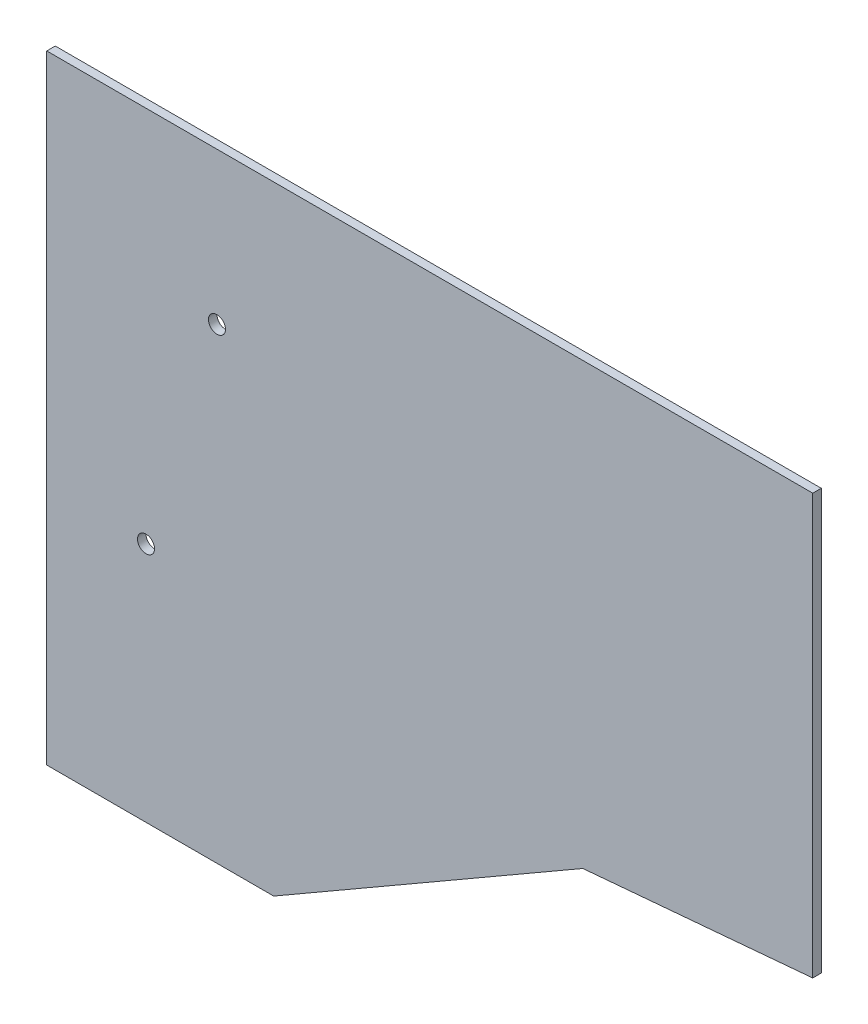
ISO-10303-21;
HEADER;
FILE_DESCRIPTION(('STEP AP214'),'2;1');
FILE_NAME('part.step','',(''),(''),'','','');
FILE_SCHEMA(('AUTOMOTIVE_DESIGN { 1 0 10303 214 1 1 1 1 }'));
ENDSEC;
DATA;
#1=APPLICATION_CONTEXT('core data for automotive mechanical design processes');
#2=APPLICATION_PROTOCOL_DEFINITION('international standard','automotive_design',2000,#1);
#3=PRODUCT_CONTEXT('',#1,'mechanical');
#4=PRODUCT('Part','Part','',(#3));
#5=PRODUCT_RELATED_PRODUCT_CATEGORY('part','',(#4));
#6=PRODUCT_DEFINITION_FORMATION('','',#4);
#7=PRODUCT_DEFINITION_CONTEXT('part definition',#1,'design');
#8=PRODUCT_DEFINITION('design','',#6,#7);
#9=PRODUCT_DEFINITION_SHAPE('','',#8);
#10=(LENGTH_UNIT() NAMED_UNIT(*) SI_UNIT(.MILLI.,.METRE.));
#11=(NAMED_UNIT(*) PLANE_ANGLE_UNIT() SI_UNIT($,.RADIAN.));
#12=(NAMED_UNIT(*) SI_UNIT($,.STERADIAN.) SOLID_ANGLE_UNIT());
#13=UNCERTAINTY_MEASURE_WITH_UNIT(LENGTH_MEASURE(1.E-05),#10,'distance_accuracy_value','');
#14=(GEOMETRIC_REPRESENTATION_CONTEXT(3) GLOBAL_UNCERTAINTY_ASSIGNED_CONTEXT((#13)) GLOBAL_UNIT_ASSIGNED_CONTEXT((#10,
#11,#12)) REPRESENTATION_CONTEXT('',''));
#15=CARTESIAN_POINT('',(0.,0.,0.));
#16=DIRECTION('',(0.,0.,1.));
#17=DIRECTION('',(1.,0.,0.));
#18=AXIS2_PLACEMENT_3D('',#15,#16,#17);
#19=CARTESIAN_POINT('',(135.,-109.,3.));
#20=DIRECTION('',(0.,1.,0.));
#21=DIRECTION('',(-1.,0.,0.));
#22=AXIS2_PLACEMENT_3D('',#19,#20,#21);
#23=PLANE('',#22);
#24=DIRECTION('',(0.,0.,-1.));
#25=VECTOR('',#24,1.);
#26=CARTESIAN_POINT('',(-55.,-109.,440.543225511879));
#27=LINE('',#26,#25);
#28=CARTESIAN_POINT('',(-55.,-109.,3.));
#29=VERTEX_POINT('',#28);
#30=CARTESIAN_POINT('',(-55.,-109.,0.));
#31=VERTEX_POINT('',#30);
#32=EDGE_CURVE('E97',#29,#31,#27,.T.);
#33=ORIENTED_EDGE('',*,*,#32,.F.);
#34=DIRECTION('',(1.,0.,0.));
#35=VECTOR('',#34,1.);
#36=CARTESIAN_POINT('',(135.,-109.,3.));
#37=LINE('',#36,#35);
#38=CARTESIAN_POINT('',(-135.,-109.,3.));
#39=VERTEX_POINT('',#38);
#40=EDGE_CURVE('E118',#39,#29,#37,.T.);
#41=ORIENTED_EDGE('',*,*,#40,.F.);
#42=DIRECTION('',(0.,0.,-1.));
#43=VECTOR('',#42,1.);
#44=CARTESIAN_POINT('',(-135.,-109.,3.));
#45=LINE('',#44,#43);
#46=CARTESIAN_POINT('',(-135.,-109.,0.));
#47=VERTEX_POINT('',#46);
#48=EDGE_CURVE('E98',#39,#47,#45,.T.);
#49=ORIENTED_EDGE('',*,*,#48,.T.);
#50=DIRECTION('',(1.,0.,0.));
#51=VECTOR('',#50,1.);
#52=CARTESIAN_POINT('',(135.,-109.,0.));
#53=LINE('',#52,#51);
#54=EDGE_CURVE('E129',#47,#31,#53,.T.);
#55=ORIENTED_EDGE('',*,*,#54,.T.);
#56=EDGE_LOOP('',(#33,#41,#49,#55));
#57=FACE_BOUND('',#56,.T.);
#58=ADVANCED_FACE('F33',(#57),#23,.F.);
#59=CARTESIAN_POINT('',(135.,-109.,3.));
#60=DIRECTION('',(-1.,0.,0.));
#61=DIRECTION('',(0.,0.,1.));
#62=AXIS2_PLACEMENT_3D('',#59,#60,#61);
#63=PLANE('',#62);
#64=DIRECTION('',(0.,0.,-1.));
#65=VECTOR('',#64,1.);
#66=CARTESIAN_POINT('',(135.,-39.,440.543225511879));
#67=LINE('',#66,#65);
#68=CARTESIAN_POINT('',(135.,-39.,3.));
#69=VERTEX_POINT('',#68);
#70=CARTESIAN_POINT('',(135.,-39.,0.));
#71=VERTEX_POINT('',#70);
#72=EDGE_CURVE('E101',#69,#71,#67,.T.);
#73=ORIENTED_EDGE('',*,*,#72,.T.);
#74=DIRECTION('',(0.,1.,0.));
#75=VECTOR('',#74,1.);
#76=CARTESIAN_POINT('',(135.,-109.,0.));
#77=LINE('',#76,#75);
#78=CARTESIAN_POINT('',(135.,109.,0.));
#79=VERTEX_POINT('',#78);
#80=EDGE_CURVE('E88',#71,#79,#77,.T.);
#81=ORIENTED_EDGE('',*,*,#80,.T.);
#82=DIRECTION('',(0.,0.,-1.));
#83=VECTOR('',#82,1.);
#84=CARTESIAN_POINT('',(135.,109.,3.));
#85=LINE('',#84,#83);
#86=CARTESIAN_POINT('',(135.,109.,3.));
#87=VERTEX_POINT('',#86);
#88=EDGE_CURVE('E135',#87,#79,#85,.T.);
#89=ORIENTED_EDGE('',*,*,#88,.F.);
#90=DIRECTION('',(0.,1.,0.));
#91=VECTOR('',#90,1.);
#92=CARTESIAN_POINT('',(135.,-109.,3.));
#93=LINE('',#92,#91);
#94=EDGE_CURVE('E121',#69,#87,#93,.T.);
#95=ORIENTED_EDGE('',*,*,#94,.F.);
#96=EDGE_LOOP('',(#73,#81,#89,#95));
#97=FACE_BOUND('',#96,.T.);
#98=ADVANCED_FACE('F160',(#97),#63,.F.);
#99=CARTESIAN_POINT('',(0.,0.,3.));
#100=DIRECTION('',(0.,0.,1.));
#101=DIRECTION('',(1.,0.,0.));
#102=AXIS2_PLACEMENT_3D('',#99,#100,#101);
#103=PLANE('',#102);
#104=CARTESIAN_POINT('',(-75.,55.5,3.));
#105=DIRECTION('',(0.,0.,1.));
#106=DIRECTION('',(1.,0.,0.));
#107=AXIS2_PLACEMENT_3D('',#104,#105,#106);
#108=CIRCLE('',#107,3.00000000000001);
#109=CARTESIAN_POINT('',(-72.,55.5,3.));
#110=VERTEX_POINT('',#109);
#111=EDGE_CURVE('E107',#110,#110,#108,.T.);
#112=ORIENTED_EDGE('',*,*,#111,.F.);
#113=EDGE_LOOP('',(#112));
#114=FACE_BOUND('',#113,.T.);
#115=CARTESIAN_POINT('',(-100.,-24.,3.));
#116=DIRECTION('',(0.,0.,1.));
#117=DIRECTION('',(1.,0.,0.));
#118=AXIS2_PLACEMENT_3D('',#115,#116,#117);
#119=CIRCLE('',#118,3.00000000000001);
#120=CARTESIAN_POINT('',(-97.,-24.,3.));
#121=VERTEX_POINT('',#120);
#122=EDGE_CURVE('E111',#121,#121,#119,.T.);
#123=ORIENTED_EDGE('',*,*,#122,.F.);
#124=EDGE_LOOP('',(#123));
#125=FACE_BOUND('',#124,.T.);
#126=DIRECTION('',(0.866025403784442,0.499999999999995,0.));
#127=VECTOR('',#126,1.);
#128=CARTESIAN_POINT('',(33.4483845062519,-57.9343013959286,3.));
#129=LINE('',#128,#127);
#130=CARTESIAN_POINT('',(53.9637426426922,-46.0897538533334,3.));
#131=VERTEX_POINT('',#130);
#132=EDGE_CURVE('E48',#29,#131,#129,.T.);
#133=ORIENTED_EDGE('',*,*,#132,.T.);
#134=DIRECTION('',(0.996194698091746,0.0871557427476549,0.));
#135=VECTOR('',#134,1.);
#136=CARTESIAN_POINT('',(4.41161613618089,-50.4250031762554,3.));
#137=LINE('',#136,#135);
#138=EDGE_CURVE('E52',#131,#69,#137,.T.);
#139=ORIENTED_EDGE('',*,*,#138,.T.);
#140=ORIENTED_EDGE('',*,*,#94,.T.);
#141=DIRECTION('',(-1.,0.,0.));
#142=VECTOR('',#141,1.);
#143=CARTESIAN_POINT('',(135.,109.,3.));
#144=LINE('',#143,#142);
#145=CARTESIAN_POINT('',(-135.,109.,3.));
#146=VERTEX_POINT('',#145);
#147=EDGE_CURVE('E123',#87,#146,#144,.T.);
#148=ORIENTED_EDGE('',*,*,#147,.T.);
#149=DIRECTION('',(0.,-1.,0.));
#150=VECTOR('',#149,1.);
#151=CARTESIAN_POINT('',(-135.,-109.,3.));
#152=LINE('',#151,#150);
#153=EDGE_CURVE('E115',#146,#39,#152,.T.);
#154=ORIENTED_EDGE('',*,*,#153,.T.);
#155=ORIENTED_EDGE('',*,*,#40,.T.);
#156=EDGE_LOOP('',(#133,#139,#140,#148,#154,#155));
#157=FACE_BOUND('',#156,.T.);
#158=ADVANCED_FACE('F165',(#114,#125,#157),#103,.T.);
#159=CARTESIAN_POINT('',(0.,0.,0.));
#160=DIRECTION('',(0.,0.,1.));
#161=DIRECTION('',(1.,0.,0.));
#162=AXIS2_PLACEMENT_3D('',#159,#160,#161);
#163=PLANE('',#162);
#164=CARTESIAN_POINT('',(-100.,-24.,0.));
#165=DIRECTION('',(0.,0.,1.));
#166=DIRECTION('',(1.,0.,0.));
#167=AXIS2_PLACEMENT_3D('',#164,#165,#166);
#168=CIRCLE('',#167,3.00000000000001);
#169=CARTESIAN_POINT('',(-97.,-24.,0.));
#170=VERTEX_POINT('',#169);
#171=EDGE_CURVE('E114',#170,#170,#168,.T.);
#172=ORIENTED_EDGE('',*,*,#171,.T.);
#173=EDGE_LOOP('',(#172));
#174=FACE_BOUND('',#173,.T.);
#175=CARTESIAN_POINT('',(-75.,55.5,0.));
#176=DIRECTION('',(0.,0.,1.));
#177=DIRECTION('',(1.,0.,0.));
#178=AXIS2_PLACEMENT_3D('',#175,#176,#177);
#179=CIRCLE('',#178,3.00000000000001);
#180=CARTESIAN_POINT('',(-72.,55.5,0.));
#181=VERTEX_POINT('',#180);
#182=EDGE_CURVE('E110',#181,#181,#179,.T.);
#183=ORIENTED_EDGE('',*,*,#182,.T.);
#184=EDGE_LOOP('',(#183));
#185=FACE_BOUND('',#184,.T.);
#186=DIRECTION('',(0.996194698091746,0.0871557427476549,0.));
#187=VECTOR('',#186,1.);
#188=CARTESIAN_POINT('',(4.41161613618089,-50.4250031762554,0.));
#189=LINE('',#188,#187);
#190=CARTESIAN_POINT('',(53.9637426426922,-46.0897538533334,0.));
#191=VERTEX_POINT('',#190);
#192=EDGE_CURVE('E11',#191,#71,#189,.T.);
#193=ORIENTED_EDGE('',*,*,#192,.F.);
#194=DIRECTION('',(0.866025403784442,0.499999999999995,0.));
#195=VECTOR('',#194,1.);
#196=CARTESIAN_POINT('',(33.4483845062519,-57.9343013959286,0.));
#197=LINE('',#196,#195);
#198=EDGE_CURVE('E41',#31,#191,#197,.T.);
#199=ORIENTED_EDGE('',*,*,#198,.F.);
#200=ORIENTED_EDGE('',*,*,#54,.F.);
#201=DIRECTION('',(0.,-1.,0.));
#202=VECTOR('',#201,1.);
#203=CARTESIAN_POINT('',(-135.,-109.,0.));
#204=LINE('',#203,#202);
#205=CARTESIAN_POINT('',(-135.,109.,0.));
#206=VERTEX_POINT('',#205);
#207=EDGE_CURVE('E126',#206,#47,#204,.T.);
#208=ORIENTED_EDGE('',*,*,#207,.F.);
#209=DIRECTION('',(-1.,0.,0.));
#210=VECTOR('',#209,1.);
#211=CARTESIAN_POINT('',(135.,109.,0.));
#212=LINE('',#211,#210);
#213=EDGE_CURVE('E119',#79,#206,#212,.T.);
#214=ORIENTED_EDGE('',*,*,#213,.F.);
#215=ORIENTED_EDGE('',*,*,#80,.F.);
#216=EDGE_LOOP('',(#193,#199,#200,#208,#214,#215));
#217=FACE_BOUND('',#216,.T.);
#218=ADVANCED_FACE('F85',(#174,#185,#217),#163,.F.);
#219=CARTESIAN_POINT('',(-135.,-109.,3.));
#220=DIRECTION('',(1.,0.,0.));
#221=DIRECTION('',(0.,0.,-1.));
#222=AXIS2_PLACEMENT_3D('',#219,#220,#221);
#223=PLANE('',#222);
#224=ORIENTED_EDGE('',*,*,#207,.T.);
#225=ORIENTED_EDGE('',*,*,#48,.F.);
#226=ORIENTED_EDGE('',*,*,#153,.F.);
#227=DIRECTION('',(0.,0.,-1.));
#228=VECTOR('',#227,1.);
#229=CARTESIAN_POINT('',(-135.,109.,3.));
#230=LINE('',#229,#228);
#231=EDGE_CURVE('E125',#146,#206,#230,.T.);
#232=ORIENTED_EDGE('',*,*,#231,.T.);
#233=EDGE_LOOP('',(#224,#225,#226,#232));
#234=FACE_BOUND('',#233,.T.);
#235=ADVANCED_FACE('F35',(#234),#223,.F.);
#236=CARTESIAN_POINT('',(135.,109.,3.));
#237=DIRECTION('',(0.,-1.,0.));
#238=DIRECTION('',(1.,0.,0.));
#239=AXIS2_PLACEMENT_3D('',#236,#237,#238);
#240=PLANE('',#239);
#241=ORIENTED_EDGE('',*,*,#213,.T.);
#242=ORIENTED_EDGE('',*,*,#231,.F.);
#243=ORIENTED_EDGE('',*,*,#147,.F.);
#244=ORIENTED_EDGE('',*,*,#88,.T.);
#245=EDGE_LOOP('',(#241,#242,#243,#244));
#246=FACE_BOUND('',#245,.T.);
#247=ADVANCED_FACE('F156',(#246),#240,.F.);
#248=CARTESIAN_POINT('',(-100.,-24.,-7.));
#249=DIRECTION('',(0.,0.,1.));
#250=DIRECTION('',(1.,0.,0.));
#251=AXIS2_PLACEMENT_3D('',#248,#249,#250);
#252=CYLINDRICAL_SURFACE('',#251,3.00000000000001);
#253=ORIENTED_EDGE('',*,*,#122,.T.);
#254=EDGE_LOOP('',(#253));
#255=FACE_BOUND('',#254,.T.);
#256=ORIENTED_EDGE('',*,*,#171,.F.);
#257=EDGE_LOOP('',(#256));
#258=FACE_BOUND('',#257,.T.);
#259=ADVANCED_FACE('F148',(#255,#258),#252,.F.);
#260=CARTESIAN_POINT('',(-75.,55.5,-7.));
#261=DIRECTION('',(0.,0.,1.));
#262=DIRECTION('',(1.,0.,0.));
#263=AXIS2_PLACEMENT_3D('',#260,#261,#262);
#264=CYLINDRICAL_SURFACE('',#263,3.00000000000001);
#265=ORIENTED_EDGE('',*,*,#111,.T.);
#266=EDGE_LOOP('',(#265));
#267=FACE_BOUND('',#266,.T.);
#268=ORIENTED_EDGE('',*,*,#182,.F.);
#269=EDGE_LOOP('',(#268));
#270=FACE_BOUND('',#269,.T.);
#271=ADVANCED_FACE('F146',(#267,#270),#264,.F.);
#272=CARTESIAN_POINT('',(53.9637426426922,-46.0897538533334,440.543225511879));
#273=DIRECTION('',(0.0871557427476549,-0.996194698091746,0.));
#274=DIRECTION('',(0.996194698091746,0.0871557427476549,0.));
#275=AXIS2_PLACEMENT_3D('',#272,#273,#274);
#276=PLANE('',#275);
#277=ORIENTED_EDGE('',*,*,#138,.F.);
#278=DIRECTION('',(0.,0.,-1.));
#279=VECTOR('',#278,1.);
#280=CARTESIAN_POINT('',(53.9637426426922,-46.0897538533334,440.543225511879));
#281=LINE('',#280,#279);
#282=EDGE_CURVE('E96',#131,#191,#281,.T.);
#283=ORIENTED_EDGE('',*,*,#282,.T.);
#284=ORIENTED_EDGE('',*,*,#192,.T.);
#285=ORIENTED_EDGE('',*,*,#72,.F.);
#286=EDGE_LOOP('',(#277,#283,#284,#285));
#287=FACE_BOUND('',#286,.T.);
#288=ADVANCED_FACE('F99',(#287),#276,.T.);
#289=CARTESIAN_POINT('',(53.9637426426922,-46.0897538533334,440.543225511879));
#290=DIRECTION('',(0.499999999999995,-0.866025403784442,0.));
#291=DIRECTION('',(0.866025403784442,0.499999999999995,0.));
#292=AXIS2_PLACEMENT_3D('',#289,#290,#291);
#293=PLANE('',#292);
#294=ORIENTED_EDGE('',*,*,#132,.F.);
#295=ORIENTED_EDGE('',*,*,#32,.T.);
#296=ORIENTED_EDGE('',*,*,#198,.T.);
#297=ORIENTED_EDGE('',*,*,#282,.F.);
#298=EDGE_LOOP('',(#294,#295,#296,#297));
#299=FACE_BOUND('',#298,.T.);
#300=ADVANCED_FACE('F95',(#299),#293,.T.);
#301=CLOSED_SHELL('',(#58,#98,#158,#218,#235,#247,#259,#271,#288,#300));
#302=MANIFOLD_SOLID_BREP('B2',#301);
#303=ADVANCED_BREP_SHAPE_REPRESENTATION('',(#18,#302),#14);
#304=SHAPE_DEFINITION_REPRESENTATION(#9,#303);
ENDSEC;
END-ISO-10303-21;
